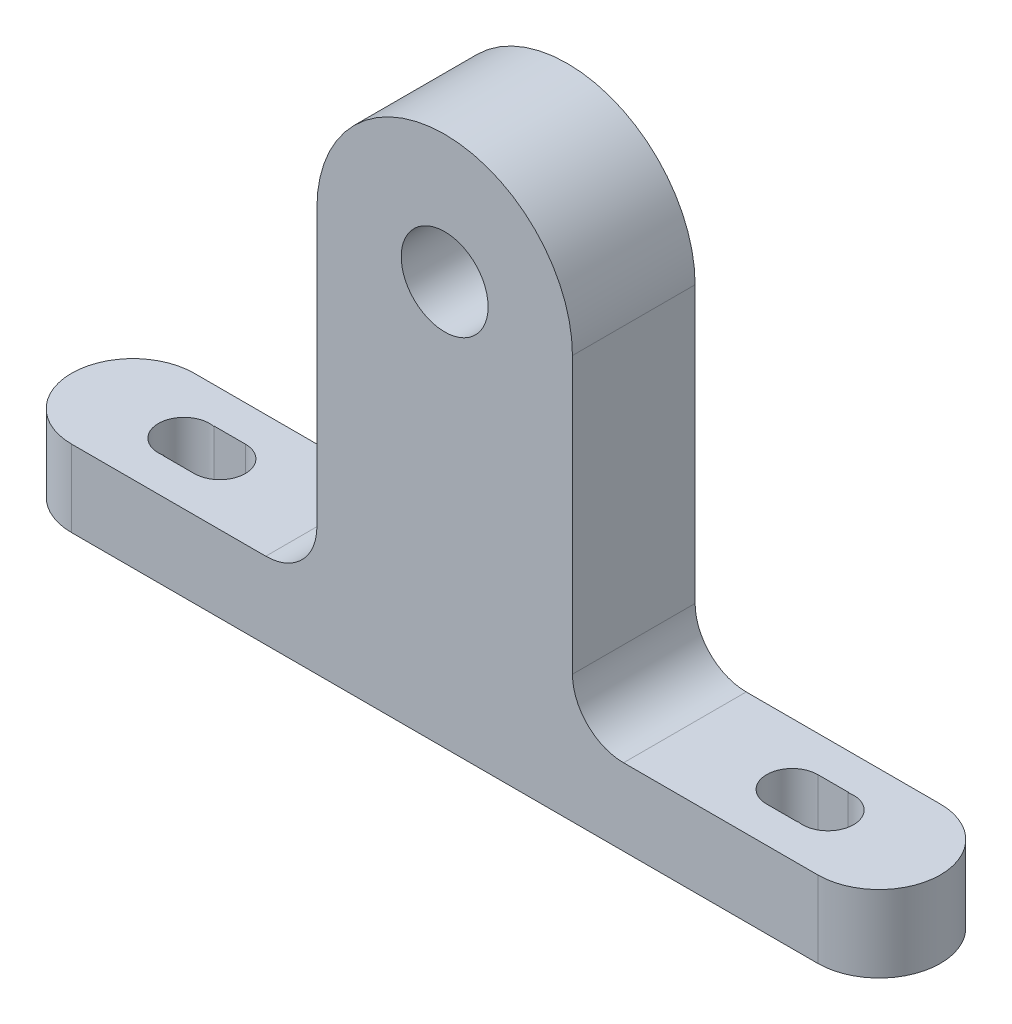
ISO-10303-21;
HEADER;
FILE_DESCRIPTION(('STEP AP214'),'2;1');
FILE_NAME('part.step','',(''),(''),'','','');
FILE_SCHEMA(('AUTOMOTIVE_DESIGN { 1 0 10303 214 1 1 1 1 }'));
ENDSEC;
DATA;
#1=APPLICATION_CONTEXT('core data for automotive mechanical design processes');
#2=APPLICATION_PROTOCOL_DEFINITION('international standard','automotive_design',2000,#1);
#3=PRODUCT_CONTEXT('',#1,'mechanical');
#4=PRODUCT('Part','Part','',(#3));
#5=PRODUCT_RELATED_PRODUCT_CATEGORY('part','',(#4));
#6=PRODUCT_DEFINITION_FORMATION('','',#4);
#7=PRODUCT_DEFINITION_CONTEXT('part definition',#1,'design');
#8=PRODUCT_DEFINITION('design','',#6,#7);
#9=PRODUCT_DEFINITION_SHAPE('','',#8);
#10=(LENGTH_UNIT() NAMED_UNIT(*) SI_UNIT(.MILLI.,.METRE.));
#11=(NAMED_UNIT(*) PLANE_ANGLE_UNIT() SI_UNIT($,.RADIAN.));
#12=(NAMED_UNIT(*) SI_UNIT($,.STERADIAN.) SOLID_ANGLE_UNIT());
#13=UNCERTAINTY_MEASURE_WITH_UNIT(LENGTH_MEASURE(1.E-05),#10,'distance_accuracy_value','');
#14=(GEOMETRIC_REPRESENTATION_CONTEXT(3) GLOBAL_UNCERTAINTY_ASSIGNED_CONTEXT((#13)) GLOBAL_UNIT_ASSIGNED_CONTEXT((#10,
#11,#12)) REPRESENTATION_CONTEXT('',''));
#15=CARTESIAN_POINT('',(0.,0.,0.));
#16=DIRECTION('',(0.,0.,1.));
#17=DIRECTION('',(1.,0.,0.));
#18=AXIS2_PLACEMENT_3D('',#15,#16,#17);
#19=CARTESIAN_POINT('',(0.,-32.,-6.));
#20=DIRECTION('',(0.,1.,0.));
#21=DIRECTION('',(0.,0.,1.));
#22=AXIS2_PLACEMENT_3D('',#19,#20,#21);
#23=PLANE('',#22);
#24=DIRECTION('',(-1.,0.,0.));
#25=VECTOR('',#24,1.);
#26=CARTESIAN_POINT('',(0.,-32.,-2.50000000000001));
#27=LINE('',#26,#25);
#28=CARTESIAN_POINT('',(31.0456439426822,-32.,-2.50000000000001));
#29=VERTEX_POINT('',#28);
#30=CARTESIAN_POINT('',(28.,-32.,-2.49999999999999));
#31=VERTEX_POINT('',#30);
#32=EDGE_CURVE('E325',#29,#31,#27,.T.);
#33=ORIENTED_EDGE('',*,*,#32,.F.);
#34=CARTESIAN_POINT('',(36.5,-32.,0.));
#35=DIRECTION('',(0.,1.,0.));
#36=DIRECTION('',(0.,0.,1.));
#37=AXIS2_PLACEMENT_3D('',#34,#35,#36);
#38=CIRCLE('',#37,5.99999999999999);
#39=CARTESIAN_POINT('',(31.025,-32.,-2.45446022579303));
#40=VERTEX_POINT('',#39);
#41=EDGE_CURVE('E659',#29,#40,#38,.T.);
#42=ORIENTED_EDGE('',*,*,#41,.T.);
#43=CARTESIAN_POINT('',(31.5,-32.,0.));
#44=DIRECTION('',(0.,1.,0.));
#45=DIRECTION('',(0.,0.,1.));
#46=AXIS2_PLACEMENT_3D('',#43,#44,#45);
#47=CIRCLE('',#46,2.5);
#48=CARTESIAN_POINT('',(31.025,-32.,2.45446022579305));
#49=VERTEX_POINT('',#48);
#50=EDGE_CURVE('E657',#49,#40,#47,.T.);
#51=ORIENTED_EDGE('',*,*,#50,.F.);
#52=CARTESIAN_POINT('',(36.5,-32.,0.));
#53=DIRECTION('',(0.,1.,0.));
#54=DIRECTION('',(0.,0.,1.));
#55=AXIS2_PLACEMENT_3D('',#52,#53,#54);
#56=CIRCLE('',#55,5.99999999999999);
#57=CARTESIAN_POINT('',(31.0456439426822,-32.,2.50000000000001));
#58=VERTEX_POINT('',#57);
#59=EDGE_CURVE('E583',#49,#58,#56,.T.);
#60=ORIENTED_EDGE('',*,*,#59,.T.);
#61=DIRECTION('',(-1.,0.,0.));
#62=VECTOR('',#61,1.);
#63=CARTESIAN_POINT('',(0.,-32.,2.50000000000001));
#64=LINE('',#63,#62);
#65=CARTESIAN_POINT('',(28.,-32.,2.50000000000001));
#66=VERTEX_POINT('',#65);
#67=EDGE_CURVE('E653',#58,#66,#64,.T.);
#68=ORIENTED_EDGE('',*,*,#67,.T.);
#69=CARTESIAN_POINT('',(28.,-32.,0.));
#70=DIRECTION('',(0.,1.,0.));
#71=DIRECTION('',(0.,0.,1.));
#72=AXIS2_PLACEMENT_3D('',#69,#70,#71);
#73=CIRCLE('',#72,2.49999999999999);
#74=EDGE_CURVE('E220',#31,#66,#73,.T.);
#75=ORIENTED_EDGE('',*,*,#74,.F.);
#76=EDGE_LOOP('',(#33,#42,#51,#60,#68,#75));
#77=FACE_BOUND('',#76,.T.);
#78=DIRECTION('',(-1.,0.,0.));
#79=VECTOR('',#78,1.);
#80=CARTESIAN_POINT('',(0.,-32.,-6.));
#81=LINE('',#80,#79);
#82=CARTESIAN_POINT('',(36.5,-32.,-6.));
#83=VERTEX_POINT('',#82);
#84=CARTESIAN_POINT('',(17.5,-32.,-6.));
#85=VERTEX_POINT('',#84);
#86=EDGE_CURVE('E219',#83,#85,#81,.T.);
#87=ORIENTED_EDGE('',*,*,#86,.T.);
#88=DIRECTION('',(0.,0.,1.));
#89=VECTOR('',#88,1.);
#90=CARTESIAN_POINT('',(17.5,-32.,6.));
#91=LINE('',#90,#89);
#92=CARTESIAN_POINT('',(17.5,-32.,6.));
#93=VERTEX_POINT('',#92);
#94=EDGE_CURVE('E263',#85,#93,#91,.T.);
#95=ORIENTED_EDGE('',*,*,#94,.T.);
#96=DIRECTION('',(-1.,0.,0.));
#97=VECTOR('',#96,1.);
#98=CARTESIAN_POINT('',(0.,-32.,6.));
#99=LINE('',#98,#97);
#100=CARTESIAN_POINT('',(36.5,-32.,6.));
#101=VERTEX_POINT('',#100);
#102=EDGE_CURVE('E298',#101,#93,#99,.T.);
#103=ORIENTED_EDGE('',*,*,#102,.F.);
#104=CARTESIAN_POINT('',(36.5,-32.,0.));
#105=DIRECTION('',(0.,1.,0.));
#106=DIRECTION('',(0.,0.,1.));
#107=AXIS2_PLACEMENT_3D('',#104,#105,#106);
#108=CIRCLE('',#107,5.99999999999999);
#109=EDGE_CURVE('E320',#101,#83,#108,.T.);
#110=ORIENTED_EDGE('',*,*,#109,.T.);
#111=EDGE_LOOP('',(#87,#95,#103,#110));
#112=FACE_BOUND('',#111,.T.);
#113=ADVANCED_FACE('F53',(#77,#112),#23,.T.);
#114=CARTESIAN_POINT('',(0.,-39.5,-6.));
#115=DIRECTION('',(0.,-1.,0.));
#116=DIRECTION('',(0.,0.,-1.));
#117=AXIS2_PLACEMENT_3D('',#114,#115,#116);
#118=PLANE('',#117);
#119=DIRECTION('',(-1.,0.,0.));
#120=VECTOR('',#119,1.);
#121=CARTESIAN_POINT('',(0.,-39.5,-2.50000000000001));
#122=LINE('',#121,#120);
#123=CARTESIAN_POINT('',(31.0456439426822,-39.5,-2.50000000000001));
#124=VERTEX_POINT('',#123);
#125=CARTESIAN_POINT('',(28.,-39.5,-2.5));
#126=VERTEX_POINT('',#125);
#127=EDGE_CURVE('E637',#124,#126,#122,.T.);
#128=ORIENTED_EDGE('',*,*,#127,.T.);
#129=CARTESIAN_POINT('',(28.,-39.5,0.));
#130=DIRECTION('',(0.,1.,0.));
#131=DIRECTION('',(0.,0.,1.));
#132=AXIS2_PLACEMENT_3D('',#129,#130,#131);
#133=CIRCLE('',#132,2.49999999999999);
#134=CARTESIAN_POINT('',(28.,-39.5,2.5));
#135=VERTEX_POINT('',#134);
#136=EDGE_CURVE('E602',#126,#135,#133,.T.);
#137=ORIENTED_EDGE('',*,*,#136,.T.);
#138=DIRECTION('',(-1.,0.,0.));
#139=VECTOR('',#138,1.);
#140=CARTESIAN_POINT('',(0.,-39.5,2.50000000000001));
#141=LINE('',#140,#139);
#142=CARTESIAN_POINT('',(31.0456439426822,-39.5,2.50000000000001));
#143=VERTEX_POINT('',#142);
#144=EDGE_CURVE('E600',#143,#135,#141,.T.);
#145=ORIENTED_EDGE('',*,*,#144,.F.);
#146=CARTESIAN_POINT('',(36.5,-39.5,0.));
#147=DIRECTION('',(0.,1.,0.));
#148=DIRECTION('',(0.,0.,1.));
#149=AXIS2_PLACEMENT_3D('',#146,#147,#148);
#150=CIRCLE('',#149,5.99999999999999);
#151=CARTESIAN_POINT('',(31.025,-39.5,2.45446022579305));
#152=VERTEX_POINT('',#151);
#153=EDGE_CURVE('E580',#152,#143,#150,.T.);
#154=ORIENTED_EDGE('',*,*,#153,.F.);
#155=CARTESIAN_POINT('',(31.5,-39.5,0.));
#156=DIRECTION('',(0.,1.,0.));
#157=DIRECTION('',(0.,0.,1.));
#158=AXIS2_PLACEMENT_3D('',#155,#156,#157);
#159=CIRCLE('',#158,2.5);
#160=CARTESIAN_POINT('',(31.025,-39.5,-2.45446022579303));
#161=VERTEX_POINT('',#160);
#162=EDGE_CURVE('E590',#152,#161,#159,.T.);
#163=ORIENTED_EDGE('',*,*,#162,.T.);
#164=CARTESIAN_POINT('',(36.5,-39.5,0.));
#165=DIRECTION('',(0.,1.,0.));
#166=DIRECTION('',(0.,0.,1.));
#167=AXIS2_PLACEMENT_3D('',#164,#165,#166);
#168=CIRCLE('',#167,5.99999999999999);
#169=EDGE_CURVE('E593',#124,#161,#168,.T.);
#170=ORIENTED_EDGE('',*,*,#169,.F.);
#171=EDGE_LOOP('',(#128,#137,#145,#154,#163,#170));
#172=FACE_BOUND('',#171,.T.);
#173=DIRECTION('',(1.,0.,0.));
#174=VECTOR('',#173,1.);
#175=CARTESIAN_POINT('',(0.,-39.5,-2.50000000000001));
#176=LINE('',#175,#174);
#177=CARTESIAN_POINT('',(-31.0456439426822,-39.5,-2.50000000000001));
#178=VERTEX_POINT('',#177);
#179=CARTESIAN_POINT('',(-28.,-39.5,-2.5));
#180=VERTEX_POINT('',#179);
#181=EDGE_CURVE('E631',#178,#180,#176,.T.);
#182=ORIENTED_EDGE('',*,*,#181,.F.);
#183=CARTESIAN_POINT('',(-36.5,-39.5,0.));
#184=DIRECTION('',(0.,1.,0.));
#185=DIRECTION('',(0.,0.,1.));
#186=AXIS2_PLACEMENT_3D('',#183,#184,#185);
#187=CIRCLE('',#186,6.);
#188=CARTESIAN_POINT('',(-31.025,-39.5,-2.45446022579303));
#189=VERTEX_POINT('',#188);
#190=EDGE_CURVE('E616',#189,#178,#187,.T.);
#191=ORIENTED_EDGE('',*,*,#190,.F.);
#192=CARTESIAN_POINT('',(-31.5,-39.5,0.));
#193=DIRECTION('',(0.,1.,0.));
#194=DIRECTION('',(0.,0.,1.));
#195=AXIS2_PLACEMENT_3D('',#192,#193,#194);
#196=CIRCLE('',#195,2.5);
#197=CARTESIAN_POINT('',(-31.025,-39.5,2.45446022579305));
#198=VERTEX_POINT('',#197);
#199=EDGE_CURVE('E618',#189,#198,#196,.T.);
#200=ORIENTED_EDGE('',*,*,#199,.T.);
#201=CARTESIAN_POINT('',(-36.5,-39.5,0.));
#202=DIRECTION('',(0.,1.,0.));
#203=DIRECTION('',(0.,0.,1.));
#204=AXIS2_PLACEMENT_3D('',#201,#202,#203);
#205=CIRCLE('',#204,6.);
#206=CARTESIAN_POINT('',(-31.0456439426822,-39.5,2.50000000000001));
#207=VERTEX_POINT('',#206);
#208=EDGE_CURVE('E622',#207,#198,#205,.T.);
#209=ORIENTED_EDGE('',*,*,#208,.F.);
#210=DIRECTION('',(1.,0.,0.));
#211=VECTOR('',#210,1.);
#212=CARTESIAN_POINT('',(0.,-39.5,2.50000000000001));
#213=LINE('',#212,#211);
#214=CARTESIAN_POINT('',(-28.,-39.5,2.50000000000001));
#215=VERTEX_POINT('',#214);
#216=EDGE_CURVE('E625',#207,#215,#213,.T.);
#217=ORIENTED_EDGE('',*,*,#216,.T.);
#218=CARTESIAN_POINT('',(-28.,-39.5,0.));
#219=DIRECTION('',(0.,1.,0.));
#220=DIRECTION('',(0.,0.,1.));
#221=AXIS2_PLACEMENT_3D('',#218,#219,#220);
#222=CIRCLE('',#221,2.5);
#223=EDGE_CURVE('E628',#215,#180,#222,.T.);
#224=ORIENTED_EDGE('',*,*,#223,.T.);
#225=EDGE_LOOP('',(#182,#191,#200,#209,#217,#224));
#226=FACE_BOUND('',#225,.T.);
#227=DIRECTION('',(1.,0.,0.));
#228=VECTOR('',#227,1.);
#229=CARTESIAN_POINT('',(0.,-39.5,-6.));
#230=LINE('',#229,#228);
#231=CARTESIAN_POINT('',(-36.5,-39.5,-6.));
#232=VERTEX_POINT('',#231);
#233=CARTESIAN_POINT('',(36.5,-39.5,-6.));
#234=VERTEX_POINT('',#233);
#235=EDGE_CURVE('E217',#232,#234,#230,.T.);
#236=ORIENTED_EDGE('',*,*,#235,.T.);
#237=CARTESIAN_POINT('',(36.5,-39.5,0.));
#238=DIRECTION('',(0.,1.,0.));
#239=DIRECTION('',(0.,0.,1.));
#240=AXIS2_PLACEMENT_3D('',#237,#238,#239);
#241=CIRCLE('',#240,5.99999999999999);
#242=CARTESIAN_POINT('',(36.5,-39.5,6.));
#243=VERTEX_POINT('',#242);
#244=EDGE_CURVE('E200',#243,#234,#241,.T.);
#245=ORIENTED_EDGE('',*,*,#244,.F.);
#246=DIRECTION('',(1.,0.,0.));
#247=VECTOR('',#246,1.);
#248=CARTESIAN_POINT('',(0.,-39.5,6.));
#249=LINE('',#248,#247);
#250=CARTESIAN_POINT('',(-36.5,-39.5,6.));
#251=VERTEX_POINT('',#250);
#252=EDGE_CURVE('E296',#251,#243,#249,.T.);
#253=ORIENTED_EDGE('',*,*,#252,.F.);
#254=CARTESIAN_POINT('',(-36.5,-39.5,0.));
#255=DIRECTION('',(0.,1.,0.));
#256=DIRECTION('',(0.,0.,1.));
#257=AXIS2_PLACEMENT_3D('',#254,#255,#256);
#258=CIRCLE('',#257,6.);
#259=EDGE_CURVE('E224',#232,#251,#258,.T.);
#260=ORIENTED_EDGE('',*,*,#259,.F.);
#261=EDGE_LOOP('',(#236,#245,#253,#260));
#262=FACE_BOUND('',#261,.T.);
#263=ADVANCED_FACE('F223',(#172,#226,#262),#118,.T.);
#264=CARTESIAN_POINT('',(0.,-32.,-6.));
#265=DIRECTION('',(0.,-1.,0.));
#266=DIRECTION('',(0.,0.,-1.));
#267=AXIS2_PLACEMENT_3D('',#264,#265,#266);
#268=PLANE('',#267);
#269=DIRECTION('',(1.,0.,0.));
#270=VECTOR('',#269,1.);
#271=CARTESIAN_POINT('',(0.,-32.,6.));
#272=LINE('',#271,#270);
#273=CARTESIAN_POINT('',(-36.5,-32.,6.));
#274=VERTEX_POINT('',#273);
#275=CARTESIAN_POINT('',(-17.5,-32.,6.));
#276=VERTEX_POINT('',#275);
#277=EDGE_CURVE('E288',#274,#276,#272,.T.);
#278=ORIENTED_EDGE('',*,*,#277,.T.);
#279=DIRECTION('',(0.,0.,1.));
#280=VECTOR('',#279,1.);
#281=CARTESIAN_POINT('',(-17.5,-32.,-6.));
#282=LINE('',#281,#280);
#283=CARTESIAN_POINT('',(-17.5,-32.,-6.));
#284=VERTEX_POINT('',#283);
#285=EDGE_CURVE('E261',#276,#284,#282,.F.);
#286=ORIENTED_EDGE('',*,*,#285,.T.);
#287=DIRECTION('',(1.,0.,0.));
#288=VECTOR('',#287,1.);
#289=CARTESIAN_POINT('',(0.,-32.,-6.));
#290=LINE('',#289,#288);
#291=CARTESIAN_POINT('',(-36.5,-32.,-6.));
#292=VERTEX_POINT('',#291);
#293=EDGE_CURVE('E226',#292,#284,#290,.T.);
#294=ORIENTED_EDGE('',*,*,#293,.F.);
#295=CARTESIAN_POINT('',(-36.5,-32.,0.));
#296=DIRECTION('',(0.,-1.,0.));
#297=DIRECTION('',(0.,0.,-1.));
#298=AXIS2_PLACEMENT_3D('',#295,#296,#297);
#299=CIRCLE('',#298,6.);
#300=EDGE_CURVE('E295',#274,#292,#299,.T.);
#301=ORIENTED_EDGE('',*,*,#300,.F.);
#302=EDGE_LOOP('',(#278,#286,#294,#301));
#303=FACE_BOUND('',#302,.T.);
#304=CARTESIAN_POINT('',(-36.5,-32.,0.));
#305=DIRECTION('',(0.,-1.,0.));
#306=DIRECTION('',(0.,0.,-1.));
#307=AXIS2_PLACEMENT_3D('',#304,#305,#306);
#308=CIRCLE('',#307,6.);
#309=CARTESIAN_POINT('',(-31.0456439426822,-32.,-2.50000000000001));
#310=VERTEX_POINT('',#309);
#311=CARTESIAN_POINT('',(-31.025,-32.,-2.45446022579303));
#312=VERTEX_POINT('',#311);
#313=EDGE_CURVE('E255',#310,#312,#308,.T.);
#314=ORIENTED_EDGE('',*,*,#313,.F.);
#315=DIRECTION('',(-1.,0.,0.));
#316=VECTOR('',#315,1.);
#317=CARTESIAN_POINT('',(0.,-32.,-2.50000000000001));
#318=LINE('',#317,#316);
#319=CARTESIAN_POINT('',(-28.,-32.,-2.5));
#320=VERTEX_POINT('',#319);
#321=EDGE_CURVE('E253',#320,#310,#318,.T.);
#322=ORIENTED_EDGE('',*,*,#321,.F.);
#323=CARTESIAN_POINT('',(-28.,-32.,0.));
#324=DIRECTION('',(0.,-1.,0.));
#325=DIRECTION('',(0.,0.,-1.));
#326=AXIS2_PLACEMENT_3D('',#323,#324,#325);
#327=CIRCLE('',#326,2.5);
#328=CARTESIAN_POINT('',(-28.,-32.,2.50000000000001));
#329=VERTEX_POINT('',#328);
#330=EDGE_CURVE('E250',#320,#329,#327,.T.);
#331=ORIENTED_EDGE('',*,*,#330,.T.);
#332=DIRECTION('',(-1.,0.,0.));
#333=VECTOR('',#332,1.);
#334=CARTESIAN_POINT('',(0.,-32.,2.50000000000001));
#335=LINE('',#334,#333);
#336=CARTESIAN_POINT('',(-31.0456439426822,-32.,2.50000000000001));
#337=VERTEX_POINT('',#336);
#338=EDGE_CURVE('E247',#329,#337,#335,.T.);
#339=ORIENTED_EDGE('',*,*,#338,.T.);
#340=CARTESIAN_POINT('',(-36.5,-32.,0.));
#341=DIRECTION('',(0.,-1.,0.));
#342=DIRECTION('',(0.,0.,-1.));
#343=AXIS2_PLACEMENT_3D('',#340,#341,#342);
#344=CIRCLE('',#343,6.);
#345=CARTESIAN_POINT('',(-31.025,-32.,2.45446022579305));
#346=VERTEX_POINT('',#345);
#347=EDGE_CURVE('E245',#346,#337,#344,.T.);
#348=ORIENTED_EDGE('',*,*,#347,.F.);
#349=CARTESIAN_POINT('',(-31.5,-32.,0.));
#350=DIRECTION('',(0.,-1.,0.));
#351=DIRECTION('',(0.,0.,-1.));
#352=AXIS2_PLACEMENT_3D('',#349,#350,#351);
#353=CIRCLE('',#352,2.5);
#354=EDGE_CURVE('E240',#346,#312,#353,.T.);
#355=ORIENTED_EDGE('',*,*,#354,.T.);
#356=EDGE_LOOP('',(#314,#322,#331,#339,#348,#355));
#357=FACE_BOUND('',#356,.T.);
#358=ADVANCED_FACE('F293',(#303,#357),#268,.F.);
#359=CARTESIAN_POINT('',(0.,0.,-6.));
#360=DIRECTION('',(0.,0.,1.));
#361=DIRECTION('',(1.,0.,0.));
#362=AXIS2_PLACEMENT_3D('',#359,#360,#361);
#363=PLANE('',#362);
#364=CARTESIAN_POINT('',(0.,0.,-6.));
#365=DIRECTION('',(0.,0.,1.));
#366=DIRECTION('',(1.,0.,0.));
#367=AXIS2_PLACEMENT_3D('',#364,#365,#366);
#368=CIRCLE('',#367,4.25);
#369=CARTESIAN_POINT('',(4.25,0.,-6.));
#370=VERTEX_POINT('',#369);
#371=EDGE_CURVE('E307',#370,#370,#368,.T.);
#372=ORIENTED_EDGE('',*,*,#371,.T.);
#373=EDGE_LOOP('',(#372));
#374=FACE_BOUND('',#373,.T.);
#375=DIRECTION('',(0.,1.,0.));
#376=VECTOR('',#375,1.);
#377=CARTESIAN_POINT('',(36.5,-39.5,-6.));
#378=LINE('',#377,#376);
#379=EDGE_CURVE('E203',#234,#83,#378,.T.);
#380=ORIENTED_EDGE('',*,*,#379,.F.);
#381=ORIENTED_EDGE('',*,*,#235,.F.);
#382=DIRECTION('',(0.,1.,0.));
#383=VECTOR('',#382,1.);
#384=CARTESIAN_POINT('',(-36.5,-39.5,-6.));
#385=LINE('',#384,#383);
#386=EDGE_CURVE('E619',#232,#292,#385,.T.);
#387=ORIENTED_EDGE('',*,*,#386,.T.);
#388=ORIENTED_EDGE('',*,*,#293,.T.);
#389=CARTESIAN_POINT('',(-17.5,-27.,-6.));
#390=DIRECTION('',(0.,0.,1.));
#391=DIRECTION('',(1.,0.,0.));
#392=AXIS2_PLACEMENT_3D('',#389,#390,#391);
#393=CIRCLE('',#392,5.);
#394=CARTESIAN_POINT('',(-12.5,-27.,-6.));
#395=VERTEX_POINT('',#394);
#396=EDGE_CURVE('E269',#284,#395,#393,.T.);
#397=ORIENTED_EDGE('',*,*,#396,.T.);
#398=DIRECTION('',(0.,1.,0.));
#399=VECTOR('',#398,1.);
#400=CARTESIAN_POINT('',(-12.5,0.,-6.));
#401=LINE('',#400,#399);
#402=CARTESIAN_POINT('',(-12.5,0.,-6.));
#403=VERTEX_POINT('',#402);
#404=EDGE_CURVE('E231',#395,#403,#401,.T.);
#405=ORIENTED_EDGE('',*,*,#404,.T.);
#406=CARTESIAN_POINT('',(0.,0.,-6.));
#407=DIRECTION('',(0.,0.,1.));
#408=DIRECTION('',(1.,0.,0.));
#409=AXIS2_PLACEMENT_3D('',#406,#407,#408);
#410=CIRCLE('',#409,12.5);
#411=CARTESIAN_POINT('',(12.5,0.,-6.));
#412=VERTEX_POINT('',#411);
#413=EDGE_CURVE('E282',#412,#403,#410,.T.);
#414=ORIENTED_EDGE('',*,*,#413,.F.);
#415=DIRECTION('',(0.,1.,0.));
#416=VECTOR('',#415,1.);
#417=CARTESIAN_POINT('',(12.5,0.,-6.));
#418=LINE('',#417,#416);
#419=CARTESIAN_POINT('',(12.5,-27.,-6.));
#420=VERTEX_POINT('',#419);
#421=EDGE_CURVE('E228',#420,#412,#418,.T.);
#422=ORIENTED_EDGE('',*,*,#421,.F.);
#423=CARTESIAN_POINT('',(17.5,-27.,-6.));
#424=DIRECTION('',(0.,0.,1.));
#425=DIRECTION('',(1.,0.,0.));
#426=AXIS2_PLACEMENT_3D('',#423,#424,#425);
#427=CIRCLE('',#426,5.);
#428=EDGE_CURVE('E12',#420,#85,#427,.T.);
#429=ORIENTED_EDGE('',*,*,#428,.T.);
#430=ORIENTED_EDGE('',*,*,#86,.F.);
#431=EDGE_LOOP('',(#380,#381,#387,#388,#397,#405,#414,#422,#429,#430));
#432=FACE_BOUND('',#431,.T.);
#433=ADVANCED_FACE('F215',(#374,#432),#363,.F.);
#434=CARTESIAN_POINT('',(0.,0.,6.));
#435=DIRECTION('',(0.,0.,1.));
#436=DIRECTION('',(1.,0.,0.));
#437=AXIS2_PLACEMENT_3D('',#434,#435,#436);
#438=PLANE('',#437);
#439=CARTESIAN_POINT('',(0.,0.,6.));
#440=DIRECTION('',(0.,0.,1.));
#441=DIRECTION('',(1.,0.,0.));
#442=AXIS2_PLACEMENT_3D('',#439,#440,#441);
#443=CIRCLE('',#442,4.25);
#444=CARTESIAN_POINT('',(4.25,0.,6.));
#445=VERTEX_POINT('',#444);
#446=EDGE_CURVE('E328',#445,#445,#443,.T.);
#447=ORIENTED_EDGE('',*,*,#446,.F.);
#448=EDGE_LOOP('',(#447));
#449=FACE_BOUND('',#448,.T.);
#450=ORIENTED_EDGE('',*,*,#252,.T.);
#451=DIRECTION('',(0.,1.,0.));
#452=VECTOR('',#451,1.);
#453=CARTESIAN_POINT('',(36.5,-39.5,6.));
#454=LINE('',#453,#452);
#455=EDGE_CURVE('E206',#243,#101,#454,.T.);
#456=ORIENTED_EDGE('',*,*,#455,.T.);
#457=ORIENTED_EDGE('',*,*,#102,.T.);
#458=CARTESIAN_POINT('',(17.5,-27.,6.));
#459=DIRECTION('',(0.,0.,1.));
#460=DIRECTION('',(1.,0.,0.));
#461=AXIS2_PLACEMENT_3D('',#458,#459,#460);
#462=CIRCLE('',#461,5.);
#463=CARTESIAN_POINT('',(12.5,-27.,6.));
#464=VERTEX_POINT('',#463);
#465=EDGE_CURVE('E61',#93,#464,#462,.F.);
#466=ORIENTED_EDGE('',*,*,#465,.T.);
#467=DIRECTION('',(0.,1.,0.));
#468=VECTOR('',#467,1.);
#469=CARTESIAN_POINT('',(12.5,0.,6.));
#470=LINE('',#469,#468);
#471=CARTESIAN_POINT('',(12.5,0.,6.));
#472=VERTEX_POINT('',#471);
#473=EDGE_CURVE('E305',#464,#472,#470,.T.);
#474=ORIENTED_EDGE('',*,*,#473,.T.);
#475=CARTESIAN_POINT('',(0.,0.,6.));
#476=DIRECTION('',(0.,0.,1.));
#477=DIRECTION('',(1.,0.,0.));
#478=AXIS2_PLACEMENT_3D('',#475,#476,#477);
#479=CIRCLE('',#478,12.5);
#480=CARTESIAN_POINT('',(-12.5,0.,6.));
#481=VERTEX_POINT('',#480);
#482=EDGE_CURVE('E300',#472,#481,#479,.T.);
#483=ORIENTED_EDGE('',*,*,#482,.T.);
#484=DIRECTION('',(0.,1.,0.));
#485=VECTOR('',#484,1.);
#486=CARTESIAN_POINT('',(-12.5,0.,6.));
#487=LINE('',#486,#485);
#488=CARTESIAN_POINT('',(-12.5,-27.,6.));
#489=VERTEX_POINT('',#488);
#490=EDGE_CURVE('E290',#489,#481,#487,.T.);
#491=ORIENTED_EDGE('',*,*,#490,.F.);
#492=CARTESIAN_POINT('',(-17.5,-27.,6.));
#493=DIRECTION('',(0.,0.,1.));
#494=DIRECTION('',(1.,0.,0.));
#495=AXIS2_PLACEMENT_3D('',#492,#493,#494);
#496=CIRCLE('',#495,5.);
#497=EDGE_CURVE('E267',#489,#276,#496,.F.);
#498=ORIENTED_EDGE('',*,*,#497,.T.);
#499=ORIENTED_EDGE('',*,*,#277,.F.);
#500=DIRECTION('',(0.,1.,0.));
#501=VECTOR('',#500,1.);
#502=CARTESIAN_POINT('',(-36.5,-39.5,6.));
#503=LINE('',#502,#501);
#504=EDGE_CURVE('E211',#251,#274,#503,.T.);
#505=ORIENTED_EDGE('',*,*,#504,.F.);
#506=EDGE_LOOP('',(#450,#456,#457,#466,#474,#483,#491,#498,#499,#505));
#507=FACE_BOUND('',#506,.T.);
#508=ADVANCED_FACE('F286',(#449,#507),#438,.T.);
#509=CARTESIAN_POINT('',(0.,0.,-6.));
#510=DIRECTION('',(0.,0.,1.));
#511=DIRECTION('',(1.,0.,0.));
#512=AXIS2_PLACEMENT_3D('',#509,#510,#511);
#513=CYLINDRICAL_SURFACE('',#512,12.5);
#514=DIRECTION('',(0.,0.,1.));
#515=VECTOR('',#514,1.);
#516=CARTESIAN_POINT('',(-12.5,0.,-6.));
#517=LINE('',#516,#515);
#518=EDGE_CURVE('E236',#403,#481,#517,.T.);
#519=ORIENTED_EDGE('',*,*,#518,.T.);
#520=ORIENTED_EDGE('',*,*,#482,.F.);
#521=DIRECTION('',(0.,0.,1.));
#522=VECTOR('',#521,1.);
#523=CARTESIAN_POINT('',(12.5,0.,-6.));
#524=LINE('',#523,#522);
#525=EDGE_CURVE('E237',#412,#472,#524,.T.);
#526=ORIENTED_EDGE('',*,*,#525,.F.);
#527=ORIENTED_EDGE('',*,*,#413,.T.);
#528=EDGE_LOOP('',(#519,#520,#526,#527));
#529=FACE_BOUND('',#528,.T.);
#530=ADVANCED_FACE('F312',(#529),#513,.T.);
#531=CARTESIAN_POINT('',(12.5,0.,-6.));
#532=DIRECTION('',(1.,0.,0.));
#533=DIRECTION('',(0.,0.,-1.));
#534=AXIS2_PLACEMENT_3D('',#531,#532,#533);
#535=PLANE('',#534);
#536=ORIENTED_EDGE('',*,*,#473,.F.);
#537=DIRECTION('',(0.,0.,1.));
#538=VECTOR('',#537,1.);
#539=CARTESIAN_POINT('',(12.5,-27.,-6.));
#540=LINE('',#539,#538);
#541=EDGE_CURVE('E68',#464,#420,#540,.F.);
#542=ORIENTED_EDGE('',*,*,#541,.T.);
#543=ORIENTED_EDGE('',*,*,#421,.T.);
#544=ORIENTED_EDGE('',*,*,#525,.T.);
#545=EDGE_LOOP('',(#536,#542,#543,#544));
#546=FACE_BOUND('',#545,.T.);
#547=ADVANCED_FACE('F330',(#546),#535,.T.);
#548=CARTESIAN_POINT('',(0.,0.,-6.));
#549=DIRECTION('',(0.,0.,1.));
#550=DIRECTION('',(1.,0.,0.));
#551=AXIS2_PLACEMENT_3D('',#548,#549,#550);
#552=CYLINDRICAL_SURFACE('',#551,4.25);
#553=ORIENTED_EDGE('',*,*,#371,.F.);
#554=EDGE_LOOP('',(#553));
#555=FACE_BOUND('',#554,.T.);
#556=ORIENTED_EDGE('',*,*,#446,.T.);
#557=EDGE_LOOP('',(#556));
#558=FACE_BOUND('',#557,.T.);
#559=ADVANCED_FACE('F332',(#555,#558),#552,.F.);
#560=CARTESIAN_POINT('',(-12.5,0.,-6.));
#561=DIRECTION('',(1.,0.,0.));
#562=DIRECTION('',(0.,0.,-1.));
#563=AXIS2_PLACEMENT_3D('',#560,#561,#562);
#564=PLANE('',#563);
#565=ORIENTED_EDGE('',*,*,#404,.F.);
#566=DIRECTION('',(0.,0.,1.));
#567=VECTOR('',#566,1.);
#568=CARTESIAN_POINT('',(-12.5,-27.,6.));
#569=LINE('',#568,#567);
#570=EDGE_CURVE('E258',#395,#489,#569,.T.);
#571=ORIENTED_EDGE('',*,*,#570,.T.);
#572=ORIENTED_EDGE('',*,*,#490,.T.);
#573=ORIENTED_EDGE('',*,*,#518,.F.);
#574=EDGE_LOOP('',(#565,#571,#572,#573));
#575=FACE_BOUND('',#574,.T.);
#576=ADVANCED_FACE('F279',(#575),#564,.F.);
#577=CARTESIAN_POINT('',(-36.5,-39.5,0.));
#578=DIRECTION('',(0.,1.,0.));
#579=DIRECTION('',(0.,0.,1.));
#580=AXIS2_PLACEMENT_3D('',#577,#578,#579);
#581=CYLINDRICAL_SURFACE('',#580,6.);
#582=ORIENTED_EDGE('',*,*,#300,.T.);
#583=ORIENTED_EDGE('',*,*,#386,.F.);
#584=ORIENTED_EDGE('',*,*,#259,.T.);
#585=ORIENTED_EDGE('',*,*,#504,.T.);
#586=EDGE_LOOP('',(#582,#583,#584,#585));
#587=FACE_BOUND('',#586,.T.);
#588=ADVANCED_FACE('F355',(#587),#581,.T.);
#589=CARTESIAN_POINT('',(36.5,-39.5,0.));
#590=DIRECTION('',(0.,1.,0.));
#591=DIRECTION('',(0.,0.,1.));
#592=AXIS2_PLACEMENT_3D('',#589,#590,#591);
#593=CYLINDRICAL_SURFACE('',#592,5.99999999999999);
#594=ORIENTED_EDGE('',*,*,#455,.F.);
#595=ORIENTED_EDGE('',*,*,#244,.T.);
#596=ORIENTED_EDGE('',*,*,#379,.T.);
#597=ORIENTED_EDGE('',*,*,#109,.F.);
#598=EDGE_LOOP('',(#594,#595,#596,#597));
#599=FACE_BOUND('',#598,.T.);
#600=ADVANCED_FACE('F202',(#599),#593,.T.);
#601=CARTESIAN_POINT('',(-36.5,-39.5,0.));
#602=DIRECTION('',(0.,1.,0.));
#603=DIRECTION('',(0.,0.,1.));
#604=AXIS2_PLACEMENT_3D('',#601,#602,#603);
#605=CYLINDRICAL_SURFACE('',#604,6.);
#606=ORIENTED_EDGE('',*,*,#313,.T.);
#607=DIRECTION('',(0.,1.,0.));
#608=VECTOR('',#607,1.);
#609=CARTESIAN_POINT('',(-31.025,-39.5,-2.45446022579303));
#610=LINE('',#609,#608);
#611=EDGE_CURVE('E633',#189,#312,#610,.T.);
#612=ORIENTED_EDGE('',*,*,#611,.F.);
#613=ORIENTED_EDGE('',*,*,#190,.T.);
#614=DIRECTION('',(0.,1.,0.));
#615=VECTOR('',#614,1.);
#616=CARTESIAN_POINT('',(-31.0456439426822,-39.5,-2.50000000000001));
#617=LINE('',#616,#615);
#618=EDGE_CURVE('E634',#178,#310,#617,.T.);
#619=ORIENTED_EDGE('',*,*,#618,.T.);
#620=EDGE_LOOP('',(#606,#612,#613,#619));
#621=FACE_BOUND('',#620,.T.);
#622=ADVANCED_FACE('F383',(#621),#605,.T.);
#623=CARTESIAN_POINT('',(0.,-39.5,-2.50000000000001));
#624=DIRECTION('',(0.,0.,1.));
#625=DIRECTION('',(1.,0.,0.));
#626=AXIS2_PLACEMENT_3D('',#623,#624,#625);
#627=PLANE('',#626);
#628=ORIENTED_EDGE('',*,*,#321,.T.);
#629=ORIENTED_EDGE('',*,*,#618,.F.);
#630=ORIENTED_EDGE('',*,*,#181,.T.);
#631=DIRECTION('',(0.,1.,0.));
#632=VECTOR('',#631,1.);
#633=CARTESIAN_POINT('',(-28.,-39.5,-2.5));
#634=LINE('',#633,#632);
#635=EDGE_CURVE('E638',#180,#320,#634,.T.);
#636=ORIENTED_EDGE('',*,*,#635,.T.);
#637=EDGE_LOOP('',(#628,#629,#630,#636));
#638=FACE_BOUND('',#637,.T.);
#639=ADVANCED_FACE('F379',(#638),#627,.T.);
#640=CARTESIAN_POINT('',(-28.,-39.5,0.));
#641=DIRECTION('',(0.,1.,0.));
#642=DIRECTION('',(0.,0.,1.));
#643=AXIS2_PLACEMENT_3D('',#640,#641,#642);
#644=CYLINDRICAL_SURFACE('',#643,2.5);
#645=ORIENTED_EDGE('',*,*,#635,.F.);
#646=ORIENTED_EDGE('',*,*,#223,.F.);
#647=DIRECTION('',(0.,1.,0.));
#648=VECTOR('',#647,1.);
#649=CARTESIAN_POINT('',(-28.,-39.5,2.50000000000001));
#650=LINE('',#649,#648);
#651=EDGE_CURVE('E641',#215,#329,#650,.T.);
#652=ORIENTED_EDGE('',*,*,#651,.T.);
#653=ORIENTED_EDGE('',*,*,#330,.F.);
#654=EDGE_LOOP('',(#645,#646,#652,#653));
#655=FACE_BOUND('',#654,.T.);
#656=ADVANCED_FACE('F382',(#655),#644,.F.);
#657=CARTESIAN_POINT('',(0.,-39.5,2.50000000000001));
#658=DIRECTION('',(0.,0.,1.));
#659=DIRECTION('',(1.,0.,0.));
#660=AXIS2_PLACEMENT_3D('',#657,#658,#659);
#661=PLANE('',#660);
#662=ORIENTED_EDGE('',*,*,#651,.F.);
#663=ORIENTED_EDGE('',*,*,#216,.F.);
#664=DIRECTION('',(0.,1.,0.));
#665=VECTOR('',#664,1.);
#666=CARTESIAN_POINT('',(-31.0456439426822,-39.5,2.50000000000001));
#667=LINE('',#666,#665);
#668=EDGE_CURVE('E644',#207,#337,#667,.T.);
#669=ORIENTED_EDGE('',*,*,#668,.T.);
#670=ORIENTED_EDGE('',*,*,#338,.F.);
#671=EDGE_LOOP('',(#662,#663,#669,#670));
#672=FACE_BOUND('',#671,.T.);
#673=ADVANCED_FACE('F387',(#672),#661,.F.);
#674=CARTESIAN_POINT('',(-36.5,-39.5,0.));
#675=DIRECTION('',(0.,1.,0.));
#676=DIRECTION('',(0.,0.,1.));
#677=AXIS2_PLACEMENT_3D('',#674,#675,#676);
#678=CYLINDRICAL_SURFACE('',#677,6.);
#679=ORIENTED_EDGE('',*,*,#347,.T.);
#680=ORIENTED_EDGE('',*,*,#668,.F.);
#681=ORIENTED_EDGE('',*,*,#208,.T.);
#682=DIRECTION('',(0.,1.,0.));
#683=VECTOR('',#682,1.);
#684=CARTESIAN_POINT('',(-31.025,-39.5,2.45446022579305));
#685=LINE('',#684,#683);
#686=EDGE_CURVE('E647',#198,#346,#685,.T.);
#687=ORIENTED_EDGE('',*,*,#686,.T.);
#688=EDGE_LOOP('',(#679,#680,#681,#687));
#689=FACE_BOUND('',#688,.T.);
#690=ADVANCED_FACE('F391',(#689),#678,.T.);
#691=CARTESIAN_POINT('',(-31.5,-39.5,0.));
#692=DIRECTION('',(0.,1.,0.));
#693=DIRECTION('',(0.,0.,1.));
#694=AXIS2_PLACEMENT_3D('',#691,#692,#693);
#695=CYLINDRICAL_SURFACE('',#694,2.5);
#696=ORIENTED_EDGE('',*,*,#686,.F.);
#697=ORIENTED_EDGE('',*,*,#199,.F.);
#698=ORIENTED_EDGE('',*,*,#611,.T.);
#699=ORIENTED_EDGE('',*,*,#354,.F.);
#700=EDGE_LOOP('',(#696,#697,#698,#699));
#701=FACE_BOUND('',#700,.T.);
#702=ADVANCED_FACE('F377',(#701),#695,.F.);
#703=CARTESIAN_POINT('',(0.,-39.5,-2.50000000000001));
#704=DIRECTION('',(0.,0.,-1.));
#705=DIRECTION('',(-1.,0.,0.));
#706=AXIS2_PLACEMENT_3D('',#703,#704,#705);
#707=PLANE('',#706);
#708=ORIENTED_EDGE('',*,*,#32,.T.);
#709=DIRECTION('',(0.,1.,0.));
#710=VECTOR('',#709,1.);
#711=CARTESIAN_POINT('',(28.,-39.5,-2.5));
#712=LINE('',#711,#710);
#713=EDGE_CURVE('E607',#126,#31,#712,.T.);
#714=ORIENTED_EDGE('',*,*,#713,.F.);
#715=ORIENTED_EDGE('',*,*,#127,.F.);
#716=DIRECTION('',(0.,1.,0.));
#717=VECTOR('',#716,1.);
#718=CARTESIAN_POINT('',(31.0456439426822,-39.5,-2.50000000000001));
#719=LINE('',#718,#717);
#720=EDGE_CURVE('E221',#124,#29,#719,.T.);
#721=ORIENTED_EDGE('',*,*,#720,.T.);
#722=EDGE_LOOP('',(#708,#714,#715,#721));
#723=FACE_BOUND('',#722,.T.);
#724=ADVANCED_FACE('F373',(#723),#707,.F.);
#725=CARTESIAN_POINT('',(36.5,-39.5,0.));
#726=DIRECTION('',(0.,1.,0.));
#727=DIRECTION('',(0.,0.,1.));
#728=AXIS2_PLACEMENT_3D('',#725,#726,#727);
#729=CYLINDRICAL_SURFACE('',#728,5.99999999999999);
#730=ORIENTED_EDGE('',*,*,#720,.F.);
#731=ORIENTED_EDGE('',*,*,#169,.T.);
#732=DIRECTION('',(0.,1.,0.));
#733=VECTOR('',#732,1.);
#734=CARTESIAN_POINT('',(31.025,-39.5,-2.45446022579303));
#735=LINE('',#734,#733);
#736=EDGE_CURVE('E585',#161,#40,#735,.T.);
#737=ORIENTED_EDGE('',*,*,#736,.T.);
#738=ORIENTED_EDGE('',*,*,#41,.F.);
#739=EDGE_LOOP('',(#730,#731,#737,#738));
#740=FACE_BOUND('',#739,.T.);
#741=ADVANCED_FACE('F376',(#740),#729,.T.);
#742=CARTESIAN_POINT('',(31.5,-39.5,0.));
#743=DIRECTION('',(0.,1.,0.));
#744=DIRECTION('',(0.,0.,1.));
#745=AXIS2_PLACEMENT_3D('',#742,#743,#744);
#746=CYLINDRICAL_SURFACE('',#745,2.5);
#747=ORIENTED_EDGE('',*,*,#50,.T.);
#748=ORIENTED_EDGE('',*,*,#736,.F.);
#749=ORIENTED_EDGE('',*,*,#162,.F.);
#750=DIRECTION('',(0.,1.,0.));
#751=VECTOR('',#750,1.);
#752=CARTESIAN_POINT('',(31.025,-39.5,2.45446022579305));
#753=LINE('',#752,#751);
#754=EDGE_CURVE('E576',#152,#49,#753,.T.);
#755=ORIENTED_EDGE('',*,*,#754,.T.);
#756=EDGE_LOOP('',(#747,#748,#749,#755));
#757=FACE_BOUND('',#756,.T.);
#758=ADVANCED_FACE('F507',(#757),#746,.F.);
#759=CARTESIAN_POINT('',(36.5,-39.5,0.));
#760=DIRECTION('',(0.,1.,0.));
#761=DIRECTION('',(0.,0.,1.));
#762=AXIS2_PLACEMENT_3D('',#759,#760,#761);
#763=CYLINDRICAL_SURFACE('',#762,5.99999999999999);
#764=ORIENTED_EDGE('',*,*,#754,.F.);
#765=ORIENTED_EDGE('',*,*,#153,.T.);
#766=DIRECTION('',(0.,1.,0.));
#767=VECTOR('',#766,1.);
#768=CARTESIAN_POINT('',(31.0456439426822,-39.5,2.50000000000001));
#769=LINE('',#768,#767);
#770=EDGE_CURVE('E586',#143,#58,#769,.T.);
#771=ORIENTED_EDGE('',*,*,#770,.T.);
#772=ORIENTED_EDGE('',*,*,#59,.F.);
#773=EDGE_LOOP('',(#764,#765,#771,#772));
#774=FACE_BOUND('',#773,.T.);
#775=ADVANCED_FACE('F368',(#774),#763,.T.);
#776=CARTESIAN_POINT('',(0.,-39.5,2.50000000000001));
#777=DIRECTION('',(0.,0.,-1.));
#778=DIRECTION('',(-1.,0.,0.));
#779=AXIS2_PLACEMENT_3D('',#776,#777,#778);
#780=PLANE('',#779);
#781=ORIENTED_EDGE('',*,*,#770,.F.);
#782=ORIENTED_EDGE('',*,*,#144,.T.);
#783=DIRECTION('',(0.,1.,0.));
#784=VECTOR('',#783,1.);
#785=CARTESIAN_POINT('',(28.,-39.5,2.50000000000001));
#786=LINE('',#785,#784);
#787=EDGE_CURVE('E612',#135,#66,#786,.T.);
#788=ORIENTED_EDGE('',*,*,#787,.T.);
#789=ORIENTED_EDGE('',*,*,#67,.F.);
#790=EDGE_LOOP('',(#781,#782,#788,#789));
#791=FACE_BOUND('',#790,.T.);
#792=ADVANCED_FACE('F362',(#791),#780,.T.);
#793=CARTESIAN_POINT('',(28.,-39.5,0.));
#794=DIRECTION('',(0.,1.,0.));
#795=DIRECTION('',(0.,0.,1.));
#796=AXIS2_PLACEMENT_3D('',#793,#794,#795);
#797=CYLINDRICAL_SURFACE('',#796,2.49999999999999);
#798=ORIENTED_EDGE('',*,*,#74,.T.);
#799=ORIENTED_EDGE('',*,*,#787,.F.);
#800=ORIENTED_EDGE('',*,*,#136,.F.);
#801=ORIENTED_EDGE('',*,*,#713,.T.);
#802=EDGE_LOOP('',(#798,#799,#800,#801));
#803=FACE_BOUND('',#802,.T.);
#804=ADVANCED_FACE('F357',(#803),#797,.F.);
#805=CARTESIAN_POINT('',(-17.5,-27.,-6.));
#806=DIRECTION('',(0.,0.,-1.));
#807=DIRECTION('',(-1.,0.,0.));
#808=AXIS2_PLACEMENT_3D('',#805,#806,#807);
#809=CYLINDRICAL_SURFACE('',#808,5.);
#810=ORIENTED_EDGE('',*,*,#396,.F.);
#811=ORIENTED_EDGE('',*,*,#285,.F.);
#812=ORIENTED_EDGE('',*,*,#497,.F.);
#813=ORIENTED_EDGE('',*,*,#570,.F.);
#814=EDGE_LOOP('',(#810,#811,#812,#813));
#815=FACE_BOUND('',#814,.T.);
#816=ADVANCED_FACE('F283',(#815),#809,.F.);
#817=CARTESIAN_POINT('',(17.5,-27.,-6.));
#818=DIRECTION('',(0.,0.,-1.));
#819=DIRECTION('',(-1.,0.,0.));
#820=AXIS2_PLACEMENT_3D('',#817,#818,#819);
#821=CYLINDRICAL_SURFACE('',#820,5.);
#822=ORIENTED_EDGE('',*,*,#428,.F.);
#823=ORIENTED_EDGE('',*,*,#541,.F.);
#824=ORIENTED_EDGE('',*,*,#465,.F.);
#825=ORIENTED_EDGE('',*,*,#94,.F.);
#826=EDGE_LOOP('',(#822,#823,#824,#825));
#827=FACE_BOUND('',#826,.T.);
#828=ADVANCED_FACE('F55',(#827),#821,.F.);
#829=CLOSED_SHELL('',(#113,#263,#358,#433,#508,#530,#547,#559,#576,#588,#600,#622,#639,#656,
#673,#690,#702,#724,#741,#758,#775,#792,#804,#816,#828));
#830=MANIFOLD_SOLID_BREP('B2',#829);
#831=ADVANCED_BREP_SHAPE_REPRESENTATION('',(#18,#830),#14);
#832=SHAPE_DEFINITION_REPRESENTATION(#9,#831);
ENDSEC;
END-ISO-10303-21;
